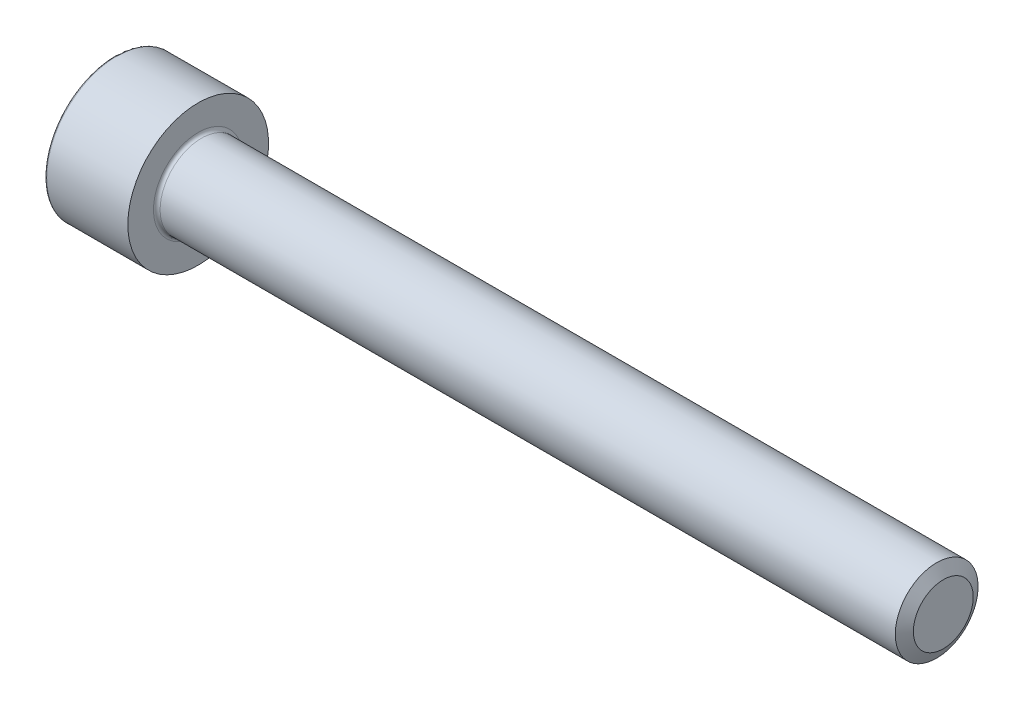
ISO-10303-21;
HEADER;
FILE_DESCRIPTION(('STEP AP214'),'2;1');
FILE_NAME('part.step','',(''),(''),'','','');
FILE_SCHEMA(('AUTOMOTIVE_DESIGN { 1 0 10303 214 1 1 1 1 }'));
ENDSEC;
DATA;
#1=APPLICATION_CONTEXT('core data for automotive mechanical design processes');
#2=APPLICATION_PROTOCOL_DEFINITION('international standard','automotive_design',2000,#1);
#3=PRODUCT_CONTEXT('',#1,'mechanical');
#4=PRODUCT('Part','Part','',(#3));
#5=PRODUCT_RELATED_PRODUCT_CATEGORY('part','',(#4));
#6=PRODUCT_DEFINITION_FORMATION('','',#4);
#7=PRODUCT_DEFINITION_CONTEXT('part definition',#1,'design');
#8=PRODUCT_DEFINITION('design','',#6,#7);
#9=PRODUCT_DEFINITION_SHAPE('','',#8);
#10=(LENGTH_UNIT() NAMED_UNIT(*) SI_UNIT(.MILLI.,.METRE.));
#11=(NAMED_UNIT(*) PLANE_ANGLE_UNIT() SI_UNIT($,.RADIAN.));
#12=(NAMED_UNIT(*) SI_UNIT($,.STERADIAN.) SOLID_ANGLE_UNIT());
#13=UNCERTAINTY_MEASURE_WITH_UNIT(LENGTH_MEASURE(1.E-05),#10,'distance_accuracy_value','');
#14=(GEOMETRIC_REPRESENTATION_CONTEXT(3) GLOBAL_UNCERTAINTY_ASSIGNED_CONTEXT((#13)) GLOBAL_UNIT_ASSIGNED_CONTEXT((#10,
#11,#12)) REPRESENTATION_CONTEXT('',''));
#15=CARTESIAN_POINT('',(0.,0.,0.));
#16=DIRECTION('',(0.,0.,1.));
#17=DIRECTION('',(1.,0.,0.));
#18=AXIS2_PLACEMENT_3D('',#15,#16,#17);
#19=CARTESIAN_POINT('',(0.,0.,0.));
#20=DIRECTION('',(-1.,0.,0.));
#21=DIRECTION('',(0.,0.,1.));
#22=AXIS2_PLACEMENT_3D('',#19,#20,#21);
#23=CYLINDRICAL_SURFACE('',#22,2.5);
#24=CARTESIAN_POINT('',(5.2,0.,0.));
#25=DIRECTION('',(-1.,0.,0.));
#26=DIRECTION('',(0.,0.,1.));
#27=AXIS2_PLACEMENT_3D('',#24,#25,#26);
#28=CIRCLE('',#27,2.5);
#29=CARTESIAN_POINT('',(5.2,0.,2.5));
#30=VERTEX_POINT('',#29);
#31=EDGE_CURVE('E148',#30,#30,#28,.T.);
#32=ORIENTED_EDGE('',*,*,#31,.F.);
#33=EDGE_LOOP('',(#32));
#34=FACE_BOUND('',#33,.T.);
#35=CARTESIAN_POINT('',(49.6000117335054,0.,0.));
#36=DIRECTION('',(-1.,0.,0.));
#37=DIRECTION('',(0.,0.,1.));
#38=AXIS2_PLACEMENT_3D('',#35,#36,#37);
#39=CIRCLE('',#38,2.5);
#40=CARTESIAN_POINT('',(49.6000117335054,0.,2.5));
#41=VERTEX_POINT('',#40);
#42=EDGE_CURVE('E285',#41,#41,#39,.T.);
#43=ORIENTED_EDGE('',*,*,#42,.T.);
#44=EDGE_LOOP('',(#43));
#45=FACE_BOUND('',#44,.T.);
#46=ADVANCED_FACE('F45',(#34,#45),#23,.T.);
#47=CARTESIAN_POINT('',(0.,0.,0.));
#48=DIRECTION('',(1.,0.,0.));
#49=DIRECTION('',(0.,0.,-1.));
#50=AXIS2_PLACEMENT_3D('',#47,#48,#49);
#51=PLANE('',#50);
#52=CARTESIAN_POINT('',(0.,0.,0.));
#53=DIRECTION('',(1.,0.,0.));
#54=DIRECTION('',(0.,0.,-1.));
#55=AXIS2_PLACEMENT_3D('',#52,#53,#54);
#56=CIRCLE('',#55,4.15);
#57=CARTESIAN_POINT('',(0.,0.,-4.15));
#58=VERTEX_POINT('',#57);
#59=EDGE_CURVE('E53',#58,#58,#56,.F.);
#60=ORIENTED_EDGE('',*,*,#59,.T.);
#61=EDGE_LOOP('',(#60));
#62=FACE_BOUND('',#61,.T.);
#63=DIRECTION('',(0.,0.866025403784439,-0.5));
#64=VECTOR('',#63,1.);
#65=CARTESIAN_POINT('',(0.,0.,2.29));
#66=LINE('',#65,#64);
#67=CARTESIAN_POINT('',(0.,0.,2.29));
#68=VERTEX_POINT('',#67);
#69=CARTESIAN_POINT('',(0.,1.98319817466637,1.145));
#70=VERTEX_POINT('',#69);
#71=EDGE_CURVE('E134',#68,#70,#66,.T.);
#72=ORIENTED_EDGE('',*,*,#71,.F.);
#73=DIRECTION('',(0.,0.866025403784439,0.5));
#74=VECTOR('',#73,1.);
#75=CARTESIAN_POINT('',(0.,-1.98319817466637,1.145));
#76=LINE('',#75,#74);
#77=CARTESIAN_POINT('',(0.,-1.98319817466637,1.145));
#78=VERTEX_POINT('',#77);
#79=EDGE_CURVE('E60',#78,#68,#76,.T.);
#80=ORIENTED_EDGE('',*,*,#79,.F.);
#81=DIRECTION('',(0.,0.,1.));
#82=VECTOR('',#81,1.);
#83=CARTESIAN_POINT('',(0.,-1.98319817466636,-1.145));
#84=LINE('',#83,#82);
#85=CARTESIAN_POINT('',(0.,-1.98319817466636,-1.145));
#86=VERTEX_POINT('',#85);
#87=EDGE_CURVE('E144',#86,#78,#84,.T.);
#88=ORIENTED_EDGE('',*,*,#87,.F.);
#89=DIRECTION('',(0.,-0.866025403784438,0.5));
#90=VECTOR('',#89,1.);
#91=CARTESIAN_POINT('',(0.,0.,-2.29));
#92=LINE('',#91,#90);
#93=CARTESIAN_POINT('',(0.,0.,-2.29));
#94=VERTEX_POINT('',#93);
#95=EDGE_CURVE('E142',#94,#86,#92,.T.);
#96=ORIENTED_EDGE('',*,*,#95,.F.);
#97=DIRECTION('',(0.,-0.866025403784439,-0.5));
#98=VECTOR('',#97,1.);
#99=CARTESIAN_POINT('',(0.,1.98319817466636,-1.145));
#100=LINE('',#99,#98);
#101=CARTESIAN_POINT('',(0.,1.98319817466636,-1.145));
#102=VERTEX_POINT('',#101);
#103=EDGE_CURVE('E108',#102,#94,#100,.T.);
#104=ORIENTED_EDGE('',*,*,#103,.F.);
#105=DIRECTION('',(0.,0.,-1.));
#106=VECTOR('',#105,1.);
#107=CARTESIAN_POINT('',(0.,1.98319817466637,1.145));
#108=LINE('',#107,#106);
#109=EDGE_CURVE('E138',#70,#102,#108,.T.);
#110=ORIENTED_EDGE('',*,*,#109,.F.);
#111=EDGE_LOOP('',(#72,#80,#88,#96,#104,#110));
#112=FACE_BOUND('',#111,.T.);
#113=ADVANCED_FACE('F165',(#62,#112),#51,.F.);
#114=CARTESIAN_POINT('',(0.,0.,0.));
#115=DIRECTION('',(-1.,0.,0.));
#116=DIRECTION('',(0.,0.,1.));
#117=AXIS2_PLACEMENT_3D('',#114,#115,#116);
#118=CYLINDRICAL_SURFACE('',#117,4.25);
#119=CARTESIAN_POINT('',(0.1,0.,0.));
#120=DIRECTION('',(1.,0.,0.));
#121=DIRECTION('',(0.,0.,-1.));
#122=AXIS2_PLACEMENT_3D('',#119,#120,#121);
#123=CIRCLE('',#122,4.25);
#124=CARTESIAN_POINT('',(0.1,0.,-4.25));
#125=VERTEX_POINT('',#124);
#126=EDGE_CURVE('E11',#125,#125,#123,.T.);
#127=ORIENTED_EDGE('',*,*,#126,.T.);
#128=EDGE_LOOP('',(#127));
#129=FACE_BOUND('',#128,.T.);
#130=CARTESIAN_POINT('',(5.,0.,0.));
#131=DIRECTION('',(-1.,0.,0.));
#132=DIRECTION('',(0.,0.,1.));
#133=AXIS2_PLACEMENT_3D('',#130,#131,#132);
#134=CIRCLE('',#133,4.25);
#135=CARTESIAN_POINT('',(5.,0.,4.25));
#136=VERTEX_POINT('',#135);
#137=EDGE_CURVE('E159',#136,#136,#134,.T.);
#138=ORIENTED_EDGE('',*,*,#137,.T.);
#139=EDGE_LOOP('',(#138));
#140=FACE_BOUND('',#139,.T.);
#141=ADVANCED_FACE('F184',(#129,#140),#118,.T.);
#142=CARTESIAN_POINT('',(5.,4.25,0.));
#143=DIRECTION('',(-1.,0.,0.));
#144=DIRECTION('',(0.,0.,1.));
#145=AXIS2_PLACEMENT_3D('',#142,#143,#144);
#146=PLANE('',#145);
#147=ORIENTED_EDGE('',*,*,#137,.F.);
#148=EDGE_LOOP('',(#147));
#149=FACE_BOUND('',#148,.T.);
#150=CARTESIAN_POINT('',(5.,0.,0.));
#151=DIRECTION('',(-1.,0.,0.));
#152=DIRECTION('',(0.,0.,1.));
#153=AXIS2_PLACEMENT_3D('',#150,#151,#152);
#154=CIRCLE('',#153,2.7);
#155=CARTESIAN_POINT('',(5.,0.,2.7));
#156=VERTEX_POINT('',#155);
#157=EDGE_CURVE('E156',#156,#156,#154,.T.);
#158=ORIENTED_EDGE('',*,*,#157,.T.);
#159=EDGE_LOOP('',(#158));
#160=FACE_BOUND('',#159,.T.);
#161=ADVANCED_FACE('F193',(#149,#160),#146,.F.);
#162=CARTESIAN_POINT('',(5.2,0.,0.));
#163=DIRECTION('',(-1.,0.,0.));
#164=DIRECTION('',(0.,0.,1.));
#165=AXIS2_PLACEMENT_3D('',#162,#163,#164);
#166=TOROIDAL_SURFACE('',#165,2.7,0.2);
#167=ORIENTED_EDGE('',*,*,#157,.F.);
#168=EDGE_LOOP('',(#167));
#169=FACE_BOUND('',#168,.T.);
#170=ORIENTED_EDGE('',*,*,#31,.T.);
#171=EDGE_LOOP('',(#170));
#172=FACE_BOUND('',#171,.T.);
#173=ADVANCED_FACE('F189',(#169,#172),#166,.F.);
#174=CARTESIAN_POINT('',(2.5,-1.98319817466637,1.145));
#175=DIRECTION('',(0.,-0.5,0.866025403784439));
#176=DIRECTION('',(0.,-0.866025403784439,-0.5));
#177=AXIS2_PLACEMENT_3D('',#174,#175,#176);
#178=PLANE('',#177);
#179=ORIENTED_EDGE('',*,*,#79,.T.);
#180=DIRECTION('',(-1.,0.,0.));
#181=VECTOR('',#180,1.);
#182=CARTESIAN_POINT('',(2.5,0.,2.29));
#183=LINE('',#182,#181);
#184=CARTESIAN_POINT('',(2.5,0.,2.29));
#185=VERTEX_POINT('',#184);
#186=EDGE_CURVE('E90',#185,#68,#183,.T.);
#187=ORIENTED_EDGE('',*,*,#186,.F.);
#188=DIRECTION('',(0.,0.866025403784439,0.5));
#189=VECTOR('',#188,1.);
#190=CARTESIAN_POINT('',(2.5,-1.98319817466637,1.145));
#191=LINE('',#190,#189);
#192=CARTESIAN_POINT('',(2.5,-1.98319817466637,1.145));
#193=VERTEX_POINT('',#192);
#194=EDGE_CURVE('E146',#193,#185,#191,.T.);
#195=ORIENTED_EDGE('',*,*,#194,.F.);
#196=DIRECTION('',(-1.,0.,0.));
#197=VECTOR('',#196,1.);
#198=CARTESIAN_POINT('',(2.5,-1.98319817466637,1.145));
#199=LINE('',#198,#197);
#200=EDGE_CURVE('E68',#193,#78,#199,.T.);
#201=ORIENTED_EDGE('',*,*,#200,.T.);
#202=EDGE_LOOP('',(#179,#187,#195,#201));
#203=FACE_BOUND('',#202,.T.);
#204=ADVANCED_FACE('F192',(#203),#178,.F.);
#205=CARTESIAN_POINT('',(2.5,-1.98319817466636,-1.145));
#206=DIRECTION('',(0.,-1.,0.));
#207=DIRECTION('',(0.,0.,-1.));
#208=AXIS2_PLACEMENT_3D('',#205,#206,#207);
#209=PLANE('',#208);
#210=ORIENTED_EDGE('',*,*,#87,.T.);
#211=ORIENTED_EDGE('',*,*,#200,.F.);
#212=DIRECTION('',(0.,0.,1.));
#213=VECTOR('',#212,1.);
#214=CARTESIAN_POINT('',(2.5,-1.98319817466636,-1.145));
#215=LINE('',#214,#213);
#216=CARTESIAN_POINT('',(2.5,-1.98319817466636,-1.145));
#217=VERTEX_POINT('',#216);
#218=EDGE_CURVE('E120',#217,#193,#215,.T.);
#219=ORIENTED_EDGE('',*,*,#218,.F.);
#220=DIRECTION('',(-1.,0.,0.));
#221=VECTOR('',#220,1.);
#222=CARTESIAN_POINT('',(2.5,-1.98319817466636,-1.145));
#223=LINE('',#222,#221);
#224=EDGE_CURVE('E112',#217,#86,#223,.T.);
#225=ORIENTED_EDGE('',*,*,#224,.T.);
#226=EDGE_LOOP('',(#210,#211,#219,#225));
#227=FACE_BOUND('',#226,.T.);
#228=ADVANCED_FACE('F223',(#227),#209,.F.);
#229=CARTESIAN_POINT('',(2.5,0.,-2.29));
#230=DIRECTION('',(0.,-0.5,-0.866025403784439));
#231=DIRECTION('',(0.,0.866025403784439,-0.5));
#232=AXIS2_PLACEMENT_3D('',#229,#230,#231);
#233=PLANE('',#232);
#234=ORIENTED_EDGE('',*,*,#95,.T.);
#235=ORIENTED_EDGE('',*,*,#224,.F.);
#236=DIRECTION('',(0.,-0.866025403784438,0.5));
#237=VECTOR('',#236,1.);
#238=CARTESIAN_POINT('',(2.5,0.,-2.29));
#239=LINE('',#238,#237);
#240=CARTESIAN_POINT('',(2.5,0.,-2.29));
#241=VERTEX_POINT('',#240);
#242=EDGE_CURVE('E116',#241,#217,#239,.T.);
#243=ORIENTED_EDGE('',*,*,#242,.F.);
#244=DIRECTION('',(-1.,0.,0.));
#245=VECTOR('',#244,1.);
#246=CARTESIAN_POINT('',(2.5,0.,-2.29));
#247=LINE('',#246,#245);
#248=EDGE_CURVE('E101',#241,#94,#247,.T.);
#249=ORIENTED_EDGE('',*,*,#248,.T.);
#250=EDGE_LOOP('',(#234,#235,#243,#249));
#251=FACE_BOUND('',#250,.T.);
#252=ADVANCED_FACE('F117',(#251),#233,.F.);
#253=CARTESIAN_POINT('',(2.5,1.98319817466636,-1.145));
#254=DIRECTION('',(0.,0.5,-0.866025403784439));
#255=DIRECTION('',(0.,0.866025403784439,0.5));
#256=AXIS2_PLACEMENT_3D('',#253,#254,#255);
#257=PLANE('',#256);
#258=ORIENTED_EDGE('',*,*,#103,.T.);
#259=ORIENTED_EDGE('',*,*,#248,.F.);
#260=DIRECTION('',(0.,-0.866025403784439,-0.5));
#261=VECTOR('',#260,1.);
#262=CARTESIAN_POINT('',(2.5,1.98319817466636,-1.145));
#263=LINE('',#262,#261);
#264=CARTESIAN_POINT('',(2.5,1.98319817466636,-1.145));
#265=VERTEX_POINT('',#264);
#266=EDGE_CURVE('E105',#265,#241,#263,.T.);
#267=ORIENTED_EDGE('',*,*,#266,.F.);
#268=DIRECTION('',(-1.,0.,0.));
#269=VECTOR('',#268,1.);
#270=CARTESIAN_POINT('',(2.5,1.98319817466636,-1.145));
#271=LINE('',#270,#269);
#272=EDGE_CURVE('E113',#265,#102,#271,.T.);
#273=ORIENTED_EDGE('',*,*,#272,.T.);
#274=EDGE_LOOP('',(#258,#259,#267,#273));
#275=FACE_BOUND('',#274,.T.);
#276=ADVANCED_FACE('F103',(#275),#257,.F.);
#277=CARTESIAN_POINT('',(2.5,1.98319817466637,1.145));
#278=DIRECTION('',(0.,1.,0.));
#279=DIRECTION('',(0.,0.,1.));
#280=AXIS2_PLACEMENT_3D('',#277,#278,#279);
#281=PLANE('',#280);
#282=ORIENTED_EDGE('',*,*,#109,.T.);
#283=ORIENTED_EDGE('',*,*,#272,.F.);
#284=DIRECTION('',(0.,0.,-1.));
#285=VECTOR('',#284,1.);
#286=CARTESIAN_POINT('',(2.5,1.98319817466637,1.145));
#287=LINE('',#286,#285);
#288=CARTESIAN_POINT('',(2.5,1.98319817466637,1.145));
#289=VERTEX_POINT('',#288);
#290=EDGE_CURVE('E126',#289,#265,#287,.T.);
#291=ORIENTED_EDGE('',*,*,#290,.F.);
#292=DIRECTION('',(-1.,0.,0.));
#293=VECTOR('',#292,1.);
#294=CARTESIAN_POINT('',(2.5,1.98319817466637,1.145));
#295=LINE('',#294,#293);
#296=EDGE_CURVE('E151',#289,#70,#295,.T.);
#297=ORIENTED_EDGE('',*,*,#296,.T.);
#298=EDGE_LOOP('',(#282,#283,#291,#297));
#299=FACE_BOUND('',#298,.T.);
#300=ADVANCED_FACE('F241',(#299),#281,.F.);
#301=CARTESIAN_POINT('',(2.5,0.,2.29));
#302=DIRECTION('',(0.,0.5,0.866025403784438));
#303=DIRECTION('',(0.,-0.866025403784439,0.5));
#304=AXIS2_PLACEMENT_3D('',#301,#302,#303);
#305=PLANE('',#304);
#306=ORIENTED_EDGE('',*,*,#71,.T.);
#307=ORIENTED_EDGE('',*,*,#296,.F.);
#308=DIRECTION('',(0.,0.866025403784439,-0.5));
#309=VECTOR('',#308,1.);
#310=CARTESIAN_POINT('',(2.5,0.,2.29));
#311=LINE('',#310,#309);
#312=EDGE_CURVE('E128',#185,#289,#311,.T.);
#313=ORIENTED_EDGE('',*,*,#312,.F.);
#314=ORIENTED_EDGE('',*,*,#186,.T.);
#315=EDGE_LOOP('',(#306,#307,#313,#314));
#316=FACE_BOUND('',#315,.T.);
#317=ADVANCED_FACE('F248',(#316),#305,.F.);
#318=CARTESIAN_POINT('',(2.5,-1.98319817466637,1.145));
#319=DIRECTION('',(1.,0.,0.));
#320=DIRECTION('',(0.,0.,-1.));
#321=AXIS2_PLACEMENT_3D('',#318,#319,#320);
#322=PLANE('',#321);
#323=ORIENTED_EDGE('',*,*,#194,.T.);
#324=ORIENTED_EDGE('',*,*,#312,.T.);
#325=ORIENTED_EDGE('',*,*,#290,.T.);
#326=ORIENTED_EDGE('',*,*,#266,.T.);
#327=ORIENTED_EDGE('',*,*,#242,.T.);
#328=ORIENTED_EDGE('',*,*,#218,.T.);
#329=EDGE_LOOP('',(#323,#324,#325,#326,#327,#328));
#330=FACE_BOUND('',#329,.T.);
#331=ADVANCED_FACE('F123',(#330),#322,.F.);
#332=CARTESIAN_POINT('',(49.6000117335054,0.,0.));
#333=DIRECTION('',(-1.,0.,0.));
#334=DIRECTION('',(0.,0.,1.));
#335=AXIS2_PLACEMENT_3D('',#332,#333,#334);
#336=CONICAL_SURFACE('',#335,2.5,1.04719755119659);
#337=CARTESIAN_POINT('',(50.,0.,0.));
#338=DIRECTION('',(-1.,0.,0.));
#339=DIRECTION('',(0.,0.,1.));
#340=AXIS2_PLACEMENT_3D('',#337,#338,#339);
#341=CIRCLE('',#340,1.8072);
#342=CARTESIAN_POINT('',(50.,0.,1.8072));
#343=VERTEX_POINT('',#342);
#344=EDGE_CURVE('E135',#343,#343,#341,.T.);
#345=ORIENTED_EDGE('',*,*,#344,.T.);
#346=EDGE_LOOP('',(#345));
#347=FACE_BOUND('',#346,.T.);
#348=ORIENTED_EDGE('',*,*,#42,.F.);
#349=EDGE_LOOP('',(#348));
#350=FACE_BOUND('',#349,.T.);
#351=ADVANCED_FACE('F174',(#347,#350),#336,.T.);
#352=CARTESIAN_POINT('',(50.,2.5,0.));
#353=DIRECTION('',(-1.,0.,0.));
#354=DIRECTION('',(0.,0.,1.));
#355=AXIS2_PLACEMENT_3D('',#352,#353,#354);
#356=PLANE('',#355);
#357=ORIENTED_EDGE('',*,*,#344,.F.);
#358=EDGE_LOOP('',(#357));
#359=FACE_BOUND('',#358,.T.);
#360=ADVANCED_FACE('F169',(#359),#356,.F.);
#361=CARTESIAN_POINT('',(0.1,0.,0.));
#362=DIRECTION('',(1.,0.,0.));
#363=DIRECTION('',(0.,0.,-1.));
#364=AXIS2_PLACEMENT_3D('',#361,#362,#363);
#365=TOROIDAL_SURFACE('',#364,4.15,0.1);
#366=ORIENTED_EDGE('',*,*,#126,.F.);
#367=EDGE_LOOP('',(#366));
#368=FACE_BOUND('',#367,.T.);
#369=ORIENTED_EDGE('',*,*,#59,.F.);
#370=EDGE_LOOP('',(#369));
#371=FACE_BOUND('',#370,.T.);
#372=ADVANCED_FACE('F47',(#368,#371),#365,.T.);
#373=CLOSED_SHELL('',(#46,#113,#141,#161,#173,#204,#228,#252,#276,#300,#317,#331,#351,#360,#372));
#374=MANIFOLD_SOLID_BREP('B2',#373);
#375=ADVANCED_BREP_SHAPE_REPRESENTATION('',(#18,#374),#14);
#376=SHAPE_DEFINITION_REPRESENTATION(#9,#375);
ENDSEC;
END-ISO-10303-21;
